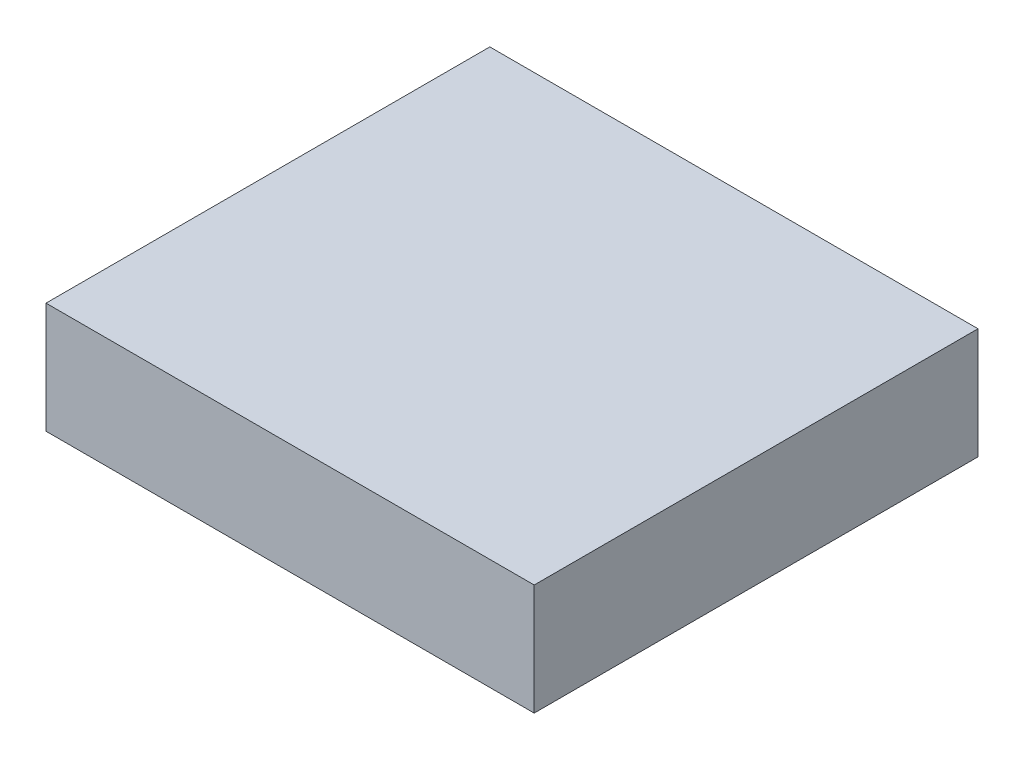
ISO-10303-21;
HEADER;
FILE_DESCRIPTION(('STEP AP214'),'2;1');
FILE_NAME('part.step','',(''),(''),'','','');
FILE_SCHEMA(('AUTOMOTIVE_DESIGN { 1 0 10303 214 1 1 1 1 }'));
ENDSEC;
DATA;
#1=APPLICATION_CONTEXT('core data for automotive mechanical design processes');
#2=APPLICATION_PROTOCOL_DEFINITION('international standard','automotive_design',2000,#1);
#3=PRODUCT_CONTEXT('',#1,'mechanical');
#4=PRODUCT('Part','Part','',(#3));
#5=PRODUCT_RELATED_PRODUCT_CATEGORY('part','',(#4));
#6=PRODUCT_DEFINITION_FORMATION('','',#4);
#7=PRODUCT_DEFINITION_CONTEXT('part definition',#1,'design');
#8=PRODUCT_DEFINITION('design','',#6,#7);
#9=PRODUCT_DEFINITION_SHAPE('','',#8);
#10=(LENGTH_UNIT() NAMED_UNIT(*) SI_UNIT(.MILLI.,.METRE.));
#11=(NAMED_UNIT(*) PLANE_ANGLE_UNIT() SI_UNIT($,.RADIAN.));
#12=(NAMED_UNIT(*) SI_UNIT($,.STERADIAN.) SOLID_ANGLE_UNIT());
#13=UNCERTAINTY_MEASURE_WITH_UNIT(LENGTH_MEASURE(1.E-05),#10,'distance_accuracy_value','');
#14=(GEOMETRIC_REPRESENTATION_CONTEXT(3) GLOBAL_UNCERTAINTY_ASSIGNED_CONTEXT((#13)) GLOBAL_UNIT_ASSIGNED_CONTEXT((#10,
#11,#12)) REPRESENTATION_CONTEXT('',''));
#15=CARTESIAN_POINT('',(0.,0.,0.));
#16=DIRECTION('',(0.,0.,1.));
#17=DIRECTION('',(1.,0.,0.));
#18=AXIS2_PLACEMENT_3D('',#15,#16,#17);
#19=CARTESIAN_POINT('',(55.,25.,-50.));
#20=DIRECTION('',(-1.,0.,0.));
#21=DIRECTION('',(0.,0.,1.));
#22=AXIS2_PLACEMENT_3D('',#19,#20,#21);
#23=PLANE('',#22);
#24=DIRECTION('',(0.,0.,-1.));
#25=VECTOR('',#24,1.);
#26=CARTESIAN_POINT('',(55.,0.,-50.));
#27=LINE('',#26,#25);
#28=CARTESIAN_POINT('',(55.,0.,50.));
#29=VERTEX_POINT('',#28);
#30=CARTESIAN_POINT('',(55.,0.,-50.));
#31=VERTEX_POINT('',#30);
#32=EDGE_CURVE('E98',#29,#31,#27,.T.);
#33=ORIENTED_EDGE('',*,*,#32,.T.);
#34=DIRECTION('',(0.,-1.,0.));
#35=VECTOR('',#34,1.);
#36=CARTESIAN_POINT('',(55.,25.,-50.));
#37=LINE('',#36,#35);
#38=CARTESIAN_POINT('',(55.,25.,-50.));
#39=VERTEX_POINT('',#38);
#40=EDGE_CURVE('E11',#39,#31,#37,.T.);
#41=ORIENTED_EDGE('',*,*,#40,.F.);
#42=DIRECTION('',(0.,0.,-1.));
#43=VECTOR('',#42,1.);
#44=CARTESIAN_POINT('',(55.,25.,-50.));
#45=LINE('',#44,#43);
#46=CARTESIAN_POINT('',(55.,25.,50.));
#47=VERTEX_POINT('',#46);
#48=EDGE_CURVE('E86',#47,#39,#45,.T.);
#49=ORIENTED_EDGE('',*,*,#48,.F.);
#50=DIRECTION('',(0.,-1.,0.));
#51=VECTOR('',#50,1.);
#52=CARTESIAN_POINT('',(55.,25.,50.));
#53=LINE('',#52,#51);
#54=EDGE_CURVE('E94',#47,#29,#53,.T.);
#55=ORIENTED_EDGE('',*,*,#54,.T.);
#56=EDGE_LOOP('',(#33,#41,#49,#55));
#57=FACE_BOUND('',#56,.T.);
#58=ADVANCED_FACE('F35',(#57),#23,.F.);
#59=CARTESIAN_POINT('',(-55.,25.,-50.));
#60=DIRECTION('',(0.,0.,1.));
#61=DIRECTION('',(1.,0.,0.));
#62=AXIS2_PLACEMENT_3D('',#59,#60,#61);
#63=PLANE('',#62);
#64=DIRECTION('',(-1.,0.,0.));
#65=VECTOR('',#64,1.);
#66=CARTESIAN_POINT('',(-55.,0.,-50.));
#67=LINE('',#66,#65);
#68=CARTESIAN_POINT('',(-55.,0.,-50.));
#69=VERTEX_POINT('',#68);
#70=EDGE_CURVE('E90',#31,#69,#67,.T.);
#71=ORIENTED_EDGE('',*,*,#70,.T.);
#72=DIRECTION('',(0.,-1.,0.));
#73=VECTOR('',#72,1.);
#74=CARTESIAN_POINT('',(-55.,25.,-50.));
#75=LINE('',#74,#73);
#76=CARTESIAN_POINT('',(-55.,25.,-50.));
#77=VERTEX_POINT('',#76);
#78=EDGE_CURVE('E43',#77,#69,#75,.T.);
#79=ORIENTED_EDGE('',*,*,#78,.F.);
#80=DIRECTION('',(-1.,0.,0.));
#81=VECTOR('',#80,1.);
#82=CARTESIAN_POINT('',(-55.,25.,-50.));
#83=LINE('',#82,#81);
#84=EDGE_CURVE('E81',#39,#77,#83,.T.);
#85=ORIENTED_EDGE('',*,*,#84,.F.);
#86=ORIENTED_EDGE('',*,*,#40,.T.);
#87=EDGE_LOOP('',(#71,#79,#85,#86));
#88=FACE_BOUND('',#87,.T.);
#89=ADVANCED_FACE('F89',(#88),#63,.F.);
#90=CARTESIAN_POINT('',(-55.,25.,-50.));
#91=DIRECTION('',(1.,0.,0.));
#92=DIRECTION('',(0.,0.,-1.));
#93=AXIS2_PLACEMENT_3D('',#90,#91,#92);
#94=PLANE('',#93);
#95=DIRECTION('',(0.,0.,1.));
#96=VECTOR('',#95,1.);
#97=CARTESIAN_POINT('',(-55.,0.,-50.));
#98=LINE('',#97,#96);
#99=CARTESIAN_POINT('',(-55.,0.,50.));
#100=VERTEX_POINT('',#99);
#101=EDGE_CURVE('E68',#69,#100,#98,.T.);
#102=ORIENTED_EDGE('',*,*,#101,.T.);
#103=DIRECTION('',(0.,-1.,0.));
#104=VECTOR('',#103,1.);
#105=CARTESIAN_POINT('',(-55.,25.,50.));
#106=LINE('',#105,#104);
#107=CARTESIAN_POINT('',(-55.,25.,50.));
#108=VERTEX_POINT('',#107);
#109=EDGE_CURVE('E91',#108,#100,#106,.T.);
#110=ORIENTED_EDGE('',*,*,#109,.F.);
#111=DIRECTION('',(0.,0.,1.));
#112=VECTOR('',#111,1.);
#113=CARTESIAN_POINT('',(-55.,25.,-50.));
#114=LINE('',#113,#112);
#115=EDGE_CURVE('E84',#77,#108,#114,.T.);
#116=ORIENTED_EDGE('',*,*,#115,.F.);
#117=ORIENTED_EDGE('',*,*,#78,.T.);
#118=EDGE_LOOP('',(#102,#110,#116,#117));
#119=FACE_BOUND('',#118,.T.);
#120=ADVANCED_FACE('F92',(#119),#94,.F.);
#121=CARTESIAN_POINT('',(-55.,25.,50.));
#122=DIRECTION('',(0.,0.,-1.));
#123=DIRECTION('',(-1.,0.,0.));
#124=AXIS2_PLACEMENT_3D('',#121,#122,#123);
#125=PLANE('',#124);
#126=DIRECTION('',(1.,0.,0.));
#127=VECTOR('',#126,1.);
#128=CARTESIAN_POINT('',(-55.,0.,50.));
#129=LINE('',#128,#127);
#130=EDGE_CURVE('E74',#100,#29,#129,.T.);
#131=ORIENTED_EDGE('',*,*,#130,.T.);
#132=ORIENTED_EDGE('',*,*,#54,.F.);
#133=DIRECTION('',(1.,0.,0.));
#134=VECTOR('',#133,1.);
#135=CARTESIAN_POINT('',(-55.,25.,50.));
#136=LINE('',#135,#134);
#137=EDGE_CURVE('E51',#108,#47,#136,.T.);
#138=ORIENTED_EDGE('',*,*,#137,.F.);
#139=ORIENTED_EDGE('',*,*,#109,.T.);
#140=EDGE_LOOP('',(#131,#132,#138,#139));
#141=FACE_BOUND('',#140,.T.);
#142=ADVANCED_FACE('F105',(#141),#125,.F.);
#143=CARTESIAN_POINT('',(0.,25.,0.));
#144=DIRECTION('',(0.,1.,0.));
#145=DIRECTION('',(0.,0.,1.));
#146=AXIS2_PLACEMENT_3D('',#143,#144,#145);
#147=PLANE('',#146);
#148=ORIENTED_EDGE('',*,*,#48,.T.);
#149=ORIENTED_EDGE('',*,*,#84,.T.);
#150=ORIENTED_EDGE('',*,*,#115,.T.);
#151=ORIENTED_EDGE('',*,*,#137,.T.);
#152=EDGE_LOOP('',(#148,#149,#150,#151));
#153=FACE_BOUND('',#152,.T.);
#154=ADVANCED_FACE('F82',(#153),#147,.T.);
#155=CARTESIAN_POINT('',(0.,0.,0.));
#156=DIRECTION('',(0.,1.,0.));
#157=DIRECTION('',(0.,0.,1.));
#158=AXIS2_PLACEMENT_3D('',#155,#156,#157);
#159=PLANE('',#158);
#160=ORIENTED_EDGE('',*,*,#32,.F.);
#161=ORIENTED_EDGE('',*,*,#130,.F.);
#162=ORIENTED_EDGE('',*,*,#101,.F.);
#163=ORIENTED_EDGE('',*,*,#70,.F.);
#164=EDGE_LOOP('',(#160,#161,#162,#163));
#165=FACE_BOUND('',#164,.T.);
#166=ADVANCED_FACE('F108',(#165),#159,.F.);
#167=CLOSED_SHELL('',(#58,#89,#120,#142,#154,#166));
#168=MANIFOLD_SOLID_BREP('B2',#167);
#169=ADVANCED_BREP_SHAPE_REPRESENTATION('',(#18,#168),#14);
#170=SHAPE_DEFINITION_REPRESENTATION(#9,#169);
ENDSEC;
END-ISO-10303-21;
